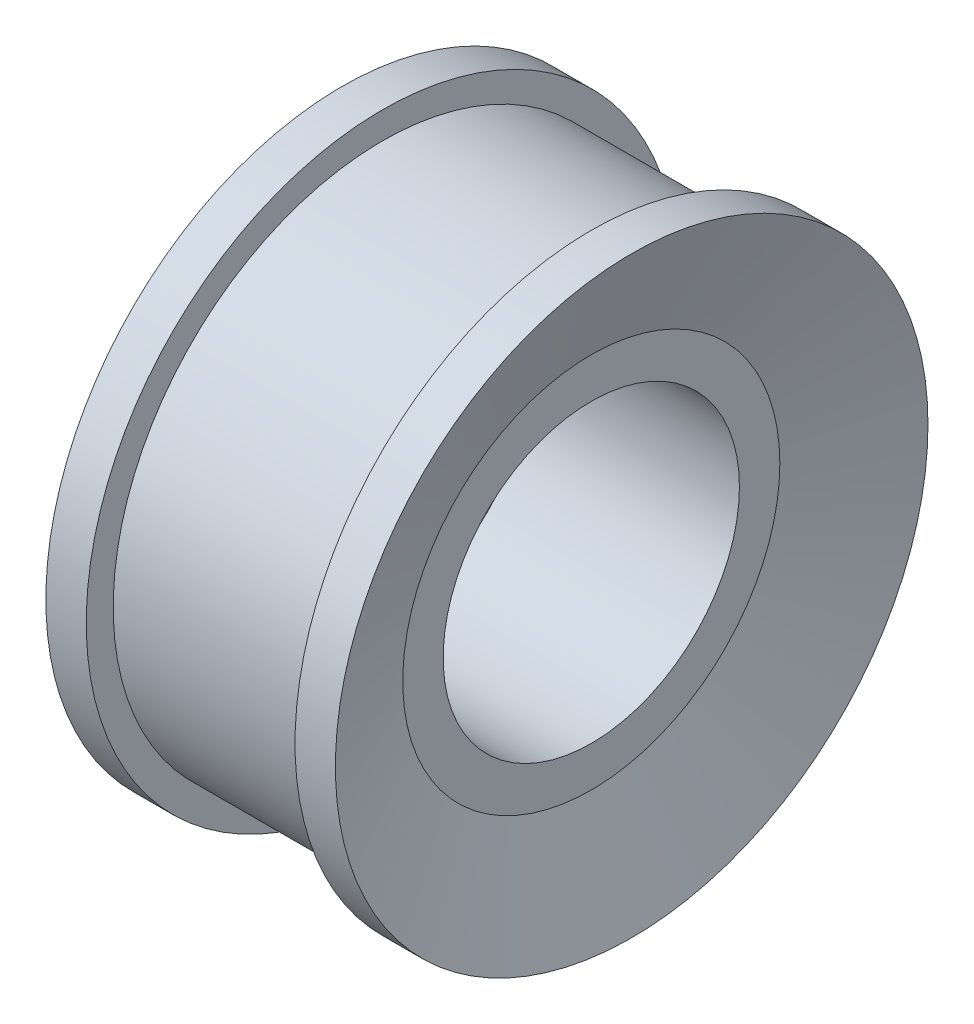
ISO-10303-21;
HEADER;
FILE_DESCRIPTION(('STEP AP214'),'2;1');
FILE_NAME('part.step','',(''),(''),'','','');
FILE_SCHEMA(('AUTOMOTIVE_DESIGN { 1 0 10303 214 1 1 1 1 }'));
ENDSEC;
DATA;
#1=APPLICATION_CONTEXT('core data for automotive mechanical design processes');
#2=APPLICATION_PROTOCOL_DEFINITION('international standard','automotive_design',2000,#1);
#3=PRODUCT_CONTEXT('',#1,'mechanical');
#4=PRODUCT('Part','Part','',(#3));
#5=PRODUCT_RELATED_PRODUCT_CATEGORY('part','',(#4));
#6=PRODUCT_DEFINITION_FORMATION('','',#4);
#7=PRODUCT_DEFINITION_CONTEXT('part definition',#1,'design');
#8=PRODUCT_DEFINITION('design','',#6,#7);
#9=PRODUCT_DEFINITION_SHAPE('','',#8);
#10=(LENGTH_UNIT() NAMED_UNIT(*) SI_UNIT(.MILLI.,.METRE.));
#11=(NAMED_UNIT(*) PLANE_ANGLE_UNIT() SI_UNIT($,.RADIAN.));
#12=(NAMED_UNIT(*) SI_UNIT($,.STERADIAN.) SOLID_ANGLE_UNIT());
#13=UNCERTAINTY_MEASURE_WITH_UNIT(LENGTH_MEASURE(1.E-05),#10,'distance_accuracy_value','');
#14=(GEOMETRIC_REPRESENTATION_CONTEXT(3) GLOBAL_UNCERTAINTY_ASSIGNED_CONTEXT((#13)) GLOBAL_UNIT_ASSIGNED_CONTEXT((#10,
#11,#12)) REPRESENTATION_CONTEXT('',''));
#15=CARTESIAN_POINT('',(0.,0.,0.));
#16=DIRECTION('',(0.,0.,1.));
#17=DIRECTION('',(1.,0.,0.));
#18=AXIS2_PLACEMENT_3D('',#15,#16,#17);
#19=CARTESIAN_POINT('',(11.825,0.,0.));
#20=DIRECTION('',(1.,0.,0.));
#21=DIRECTION('',(0.,0.,-1.));
#22=AXIS2_PLACEMENT_3D('',#19,#20,#21);
#23=CYLINDRICAL_SURFACE('',#22,11.);
#24=CARTESIAN_POINT('',(7.75,0.,0.));
#25=DIRECTION('',(1.,0.,0.));
#26=DIRECTION('',(0.,0.,-1.));
#27=AXIS2_PLACEMENT_3D('',#24,#25,#26);
#28=CIRCLE('',#27,11.);
#29=CARTESIAN_POINT('',(7.75,0.,-11.));
#30=VERTEX_POINT('',#29);
#31=EDGE_CURVE('E10',#30,#30,#28,.T.);
#32=ORIENTED_EDGE('',*,*,#31,.T.);
#33=EDGE_LOOP('',(#32));
#34=FACE_BOUND('',#33,.T.);
#35=CARTESIAN_POINT('',(-7.75,0.,0.));
#36=DIRECTION('',(1.,0.,0.));
#37=DIRECTION('',(0.,0.,-1.));
#38=AXIS2_PLACEMENT_3D('',#35,#36,#37);
#39=CIRCLE('',#38,11.);
#40=CARTESIAN_POINT('',(-7.75,0.,-11.));
#41=VERTEX_POINT('',#40);
#42=EDGE_CURVE('E80',#41,#41,#39,.T.);
#43=ORIENTED_EDGE('',*,*,#42,.F.);
#44=EDGE_LOOP('',(#43));
#45=FACE_BOUND('',#44,.T.);
#46=ADVANCED_FACE('F37',(#34,#45),#23,.F.);
#47=CARTESIAN_POINT('',(7.75,0.,0.));
#48=DIRECTION('',(1.,0.,0.));
#49=DIRECTION('',(0.,0.,-1.));
#50=AXIS2_PLACEMENT_3D('',#47,#48,#49);
#51=PLANE('',#50);
#52=CARTESIAN_POINT('',(7.75,0.,0.));
#53=DIRECTION('',(1.,0.,0.));
#54=DIRECTION('',(0.,0.,-1.));
#55=AXIS2_PLACEMENT_3D('',#52,#53,#54);
#56=CIRCLE('',#55,14.);
#57=CARTESIAN_POINT('',(7.75,0.,-14.));
#58=VERTEX_POINT('',#57);
#59=EDGE_CURVE('E44',#58,#58,#56,.T.);
#60=ORIENTED_EDGE('',*,*,#59,.T.);
#61=EDGE_LOOP('',(#60));
#62=FACE_BOUND('',#61,.T.);
#63=ORIENTED_EDGE('',*,*,#31,.F.);
#64=EDGE_LOOP('',(#63));
#65=FACE_BOUND('',#64,.T.);
#66=ADVANCED_FACE('F88',(#62,#65),#51,.T.);
#67=CARTESIAN_POINT('',(7.75,0.,0.));
#68=DIRECTION('',(1.,0.,0.));
#69=DIRECTION('',(0.,0.,-1.));
#70=AXIS2_PLACEMENT_3D('',#67,#68,#69);
#71=CONICAL_SURFACE('',#70,14.,1.21202565652432);
#72=CARTESIAN_POINT('',(10.75,0.,0.));
#73=DIRECTION('',(1.,0.,0.));
#74=DIRECTION('',(0.,0.,-1.));
#75=AXIS2_PLACEMENT_3D('',#72,#73,#74);
#76=CIRCLE('',#75,22.);
#77=CARTESIAN_POINT('',(10.75,0.,-22.));
#78=VERTEX_POINT('',#77);
#79=EDGE_CURVE('E49',#78,#78,#76,.T.);
#80=ORIENTED_EDGE('',*,*,#79,.T.);
#81=EDGE_LOOP('',(#80));
#82=FACE_BOUND('',#81,.T.);
#83=ORIENTED_EDGE('',*,*,#59,.F.);
#84=EDGE_LOOP('',(#83));
#85=FACE_BOUND('',#84,.T.);
#86=ADVANCED_FACE('F92',(#82,#85),#71,.F.);
#87=CARTESIAN_POINT('',(11.825,0.,0.));
#88=DIRECTION('',(1.,0.,0.));
#89=DIRECTION('',(0.,0.,-1.));
#90=AXIS2_PLACEMENT_3D('',#87,#88,#89);
#91=CYLINDRICAL_SURFACE('',#90,22.);
#92=ORIENTED_EDGE('',*,*,#79,.F.);
#93=EDGE_LOOP('',(#92));
#94=FACE_BOUND('',#93,.T.);
#95=CARTESIAN_POINT('',(7.75,0.,0.));
#96=DIRECTION('',(1.,0.,0.));
#97=DIRECTION('',(0.,0.,-1.));
#98=AXIS2_PLACEMENT_3D('',#95,#96,#97);
#99=CIRCLE('',#98,22.);
#100=CARTESIAN_POINT('',(7.75,0.,-22.));
#101=VERTEX_POINT('',#100);
#102=EDGE_CURVE('E54',#101,#101,#99,.T.);
#103=ORIENTED_EDGE('',*,*,#102,.T.);
#104=EDGE_LOOP('',(#103));
#105=FACE_BOUND('',#104,.T.);
#106=ADVANCED_FACE('F96',(#94,#105),#91,.T.);
#107=CARTESIAN_POINT('',(7.75,0.,0.));
#108=DIRECTION('',(1.,0.,0.));
#109=DIRECTION('',(0.,0.,-1.));
#110=AXIS2_PLACEMENT_3D('',#107,#108,#109);
#111=PLANE('',#110);
#112=ORIENTED_EDGE('',*,*,#102,.F.);
#113=EDGE_LOOP('',(#112));
#114=FACE_BOUND('',#113,.T.);
#115=CARTESIAN_POINT('',(7.75,0.,0.));
#116=DIRECTION('',(1.,0.,0.));
#117=DIRECTION('',(0.,0.,-1.));
#118=AXIS2_PLACEMENT_3D('',#115,#116,#117);
#119=CIRCLE('',#118,20.);
#120=CARTESIAN_POINT('',(7.75,0.,-20.));
#121=VERTEX_POINT('',#120);
#122=EDGE_CURVE('E60',#121,#121,#119,.T.);
#123=ORIENTED_EDGE('',*,*,#122,.T.);
#124=EDGE_LOOP('',(#123));
#125=FACE_BOUND('',#124,.T.);
#126=ADVANCED_FACE('F103',(#114,#125),#111,.F.);
#127=CARTESIAN_POINT('',(11.825,0.,0.));
#128=DIRECTION('',(1.,0.,0.));
#129=DIRECTION('',(0.,0.,-1.));
#130=AXIS2_PLACEMENT_3D('',#127,#128,#129);
#131=CYLINDRICAL_SURFACE('',#130,20.);
#132=ORIENTED_EDGE('',*,*,#122,.F.);
#133=EDGE_LOOP('',(#132));
#134=FACE_BOUND('',#133,.T.);
#135=CARTESIAN_POINT('',(-7.75,0.,0.));
#136=DIRECTION('',(1.,0.,0.));
#137=DIRECTION('',(0.,0.,-1.));
#138=AXIS2_PLACEMENT_3D('',#135,#136,#137);
#139=CIRCLE('',#138,20.);
#140=CARTESIAN_POINT('',(-7.75,0.,-20.));
#141=VERTEX_POINT('',#140);
#142=EDGE_CURVE('E64',#141,#141,#139,.T.);
#143=ORIENTED_EDGE('',*,*,#142,.T.);
#144=EDGE_LOOP('',(#143));
#145=FACE_BOUND('',#144,.T.);
#146=ADVANCED_FACE('F107',(#134,#145),#131,.T.);
#147=CARTESIAN_POINT('',(-7.75,0.,0.));
#148=DIRECTION('',(1.,0.,0.));
#149=DIRECTION('',(0.,0.,-1.));
#150=AXIS2_PLACEMENT_3D('',#147,#148,#149);
#151=PLANE('',#150);
#152=CARTESIAN_POINT('',(-7.75,0.,0.));
#153=DIRECTION('',(1.,0.,0.));
#154=DIRECTION('',(0.,0.,-1.));
#155=AXIS2_PLACEMENT_3D('',#152,#153,#154);
#156=CIRCLE('',#155,22.);
#157=CARTESIAN_POINT('',(-7.75,0.,-22.));
#158=VERTEX_POINT('',#157);
#159=EDGE_CURVE('E68',#158,#158,#156,.T.);
#160=ORIENTED_EDGE('',*,*,#159,.T.);
#161=EDGE_LOOP('',(#160));
#162=FACE_BOUND('',#161,.T.);
#163=ORIENTED_EDGE('',*,*,#142,.F.);
#164=EDGE_LOOP('',(#163));
#165=FACE_BOUND('',#164,.T.);
#166=ADVANCED_FACE('F111',(#162,#165),#151,.T.);
#167=CARTESIAN_POINT('',(11.825,0.,0.));
#168=DIRECTION('',(1.,0.,0.));
#169=DIRECTION('',(0.,0.,-1.));
#170=AXIS2_PLACEMENT_3D('',#167,#168,#169);
#171=CYLINDRICAL_SURFACE('',#170,22.);
#172=CARTESIAN_POINT('',(-10.75,0.,0.));
#173=DIRECTION('',(1.,0.,0.));
#174=DIRECTION('',(0.,0.,-1.));
#175=AXIS2_PLACEMENT_3D('',#172,#173,#174);
#176=CIRCLE('',#175,22.);
#177=CARTESIAN_POINT('',(-10.75,0.,-22.));
#178=VERTEX_POINT('',#177);
#179=EDGE_CURVE('E72',#178,#178,#176,.T.);
#180=ORIENTED_EDGE('',*,*,#179,.T.);
#181=EDGE_LOOP('',(#180));
#182=FACE_BOUND('',#181,.T.);
#183=ORIENTED_EDGE('',*,*,#159,.F.);
#184=EDGE_LOOP('',(#183));
#185=FACE_BOUND('',#184,.T.);
#186=ADVANCED_FACE('F115',(#182,#185),#171,.T.);
#187=CARTESIAN_POINT('',(-7.75,0.,0.));
#188=DIRECTION('',(-1.,0.,0.));
#189=DIRECTION('',(0.,0.,1.));
#190=AXIS2_PLACEMENT_3D('',#187,#188,#189);
#191=CONICAL_SURFACE('',#190,14.,1.21202565652432);
#192=ORIENTED_EDGE('',*,*,#179,.F.);
#193=EDGE_LOOP('',(#192));
#194=FACE_BOUND('',#193,.T.);
#195=CARTESIAN_POINT('',(-7.75,0.,0.));
#196=DIRECTION('',(1.,0.,0.));
#197=DIRECTION('',(0.,0.,-1.));
#198=AXIS2_PLACEMENT_3D('',#195,#196,#197);
#199=CIRCLE('',#198,14.);
#200=CARTESIAN_POINT('',(-7.75,0.,-14.));
#201=VERTEX_POINT('',#200);
#202=EDGE_CURVE('E76',#201,#201,#199,.T.);
#203=ORIENTED_EDGE('',*,*,#202,.T.);
#204=EDGE_LOOP('',(#203));
#205=FACE_BOUND('',#204,.T.);
#206=ADVANCED_FACE('F119',(#194,#205),#191,.F.);
#207=CARTESIAN_POINT('',(-7.75,0.,0.));
#208=DIRECTION('',(1.,0.,0.));
#209=DIRECTION('',(0.,0.,-1.));
#210=AXIS2_PLACEMENT_3D('',#207,#208,#209);
#211=PLANE('',#210);
#212=ORIENTED_EDGE('',*,*,#202,.F.);
#213=EDGE_LOOP('',(#212));
#214=FACE_BOUND('',#213,.T.);
#215=ORIENTED_EDGE('',*,*,#42,.T.);
#216=EDGE_LOOP('',(#215));
#217=FACE_BOUND('',#216,.T.);
#218=ADVANCED_FACE('F85',(#214,#217),#211,.F.);
#219=CLOSED_SHELL('',(#46,#66,#86,#106,#126,#146,#166,#186,#206,#218));
#220=MANIFOLD_SOLID_BREP('B2',#219);
#221=ADVANCED_BREP_SHAPE_REPRESENTATION('',(#18,#220),#14);
#222=SHAPE_DEFINITION_REPRESENTATION(#9,#221);
ENDSEC;
END-ISO-10303-21;
